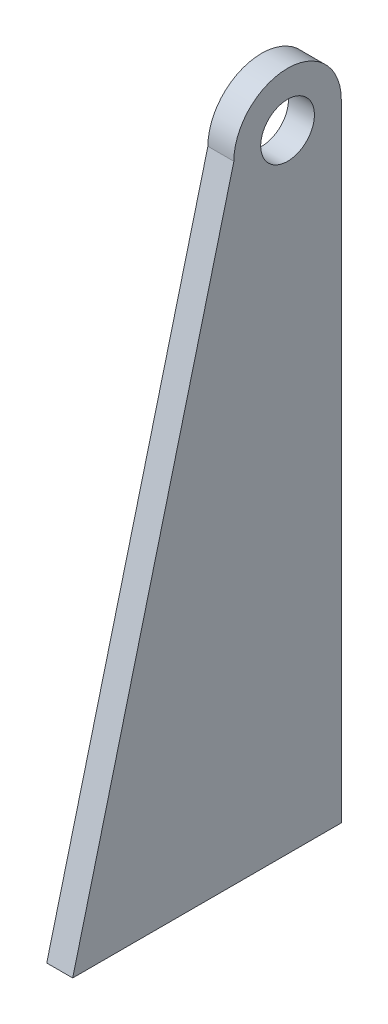
ISO-10303-21;
HEADER;
FILE_DESCRIPTION(('STEP AP214'),'2;1');
FILE_NAME('part.step','',(''),(''),'','','');
FILE_SCHEMA(('AUTOMOTIVE_DESIGN { 1 0 10303 214 1 1 1 1 }'));
ENDSEC;
DATA;
#1=APPLICATION_CONTEXT('core data for automotive mechanical design processes');
#2=APPLICATION_PROTOCOL_DEFINITION('international standard','automotive_design',2000,#1);
#3=PRODUCT_CONTEXT('',#1,'mechanical');
#4=PRODUCT('Part','Part','',(#3));
#5=PRODUCT_RELATED_PRODUCT_CATEGORY('part','',(#4));
#6=PRODUCT_DEFINITION_FORMATION('','',#4);
#7=PRODUCT_DEFINITION_CONTEXT('part definition',#1,'design');
#8=PRODUCT_DEFINITION('design','',#6,#7);
#9=PRODUCT_DEFINITION_SHAPE('','',#8);
#10=(LENGTH_UNIT() NAMED_UNIT(*) SI_UNIT(.MILLI.,.METRE.));
#11=(NAMED_UNIT(*) PLANE_ANGLE_UNIT() SI_UNIT($,.RADIAN.));
#12=(NAMED_UNIT(*) SI_UNIT($,.STERADIAN.) SOLID_ANGLE_UNIT());
#13=UNCERTAINTY_MEASURE_WITH_UNIT(LENGTH_MEASURE(1.E-05),#10,'distance_accuracy_value','');
#14=(GEOMETRIC_REPRESENTATION_CONTEXT(3) GLOBAL_UNCERTAINTY_ASSIGNED_CONTEXT((#13)) GLOBAL_UNIT_ASSIGNED_CONTEXT((#10,
#11,#12)) REPRESENTATION_CONTEXT('',''));
#15=CARTESIAN_POINT('',(0.,0.,0.));
#16=DIRECTION('',(0.,0.,1.));
#17=DIRECTION('',(1.,0.,0.));
#18=AXIS2_PLACEMENT_3D('',#15,#16,#17);
#19=CARTESIAN_POINT('',(5.8,140.,-48.));
#20=DIRECTION('',(1.,0.,0.));
#21=DIRECTION('',(0.,0.,-1.));
#22=AXIS2_PLACEMENT_3D('',#19,#20,#21);
#23=PLANE('',#22);
#24=DIRECTION('',(0.,-0.96849293259685,0.249041039810618));
#25=VECTOR('',#24,1.);
#26=CARTESIAN_POINT('',(5.8,0.,0.));
#27=LINE('',#26,#25);
#28=CARTESIAN_POINT('',(5.8,140.,-36.));
#29=VERTEX_POINT('',#28);
#30=CARTESIAN_POINT('',(5.8,0.,0.));
#31=VERTEX_POINT('',#30);
#32=EDGE_CURVE('E93',#29,#31,#27,.T.);
#33=ORIENTED_EDGE('',*,*,#32,.T.);
#34=DIRECTION('',(0.,0.,-1.));
#35=VECTOR('',#34,1.);
#36=CARTESIAN_POINT('',(5.8,0.,0.));
#37=LINE('',#36,#35);
#38=CARTESIAN_POINT('',(5.8,0.,-60.));
#39=VERTEX_POINT('',#38);
#40=EDGE_CURVE('E88',#31,#39,#37,.T.);
#41=ORIENTED_EDGE('',*,*,#40,.T.);
#42=DIRECTION('',(0.,1.,0.));
#43=VECTOR('',#42,1.);
#44=CARTESIAN_POINT('',(5.8,0.,-60.));
#45=LINE('',#44,#43);
#46=CARTESIAN_POINT('',(5.8,140.,-60.));
#47=VERTEX_POINT('',#46);
#48=EDGE_CURVE('E91',#39,#47,#45,.T.);
#49=ORIENTED_EDGE('',*,*,#48,.T.);
#50=CARTESIAN_POINT('',(5.8,140.,-48.));
#51=DIRECTION('',(1.,0.,0.));
#52=DIRECTION('',(0.,0.,-1.));
#53=AXIS2_PLACEMENT_3D('',#50,#51,#52);
#54=CIRCLE('',#53,12.);
#55=EDGE_CURVE('E58',#47,#29,#54,.T.);
#56=ORIENTED_EDGE('',*,*,#55,.T.);
#57=EDGE_LOOP('',(#33,#41,#49,#56));
#58=FACE_BOUND('',#57,.T.);
#59=CARTESIAN_POINT('',(5.8,140.,-48.));
#60=DIRECTION('',(1.,0.,0.));
#61=DIRECTION('',(0.,0.,-1.));
#62=AXIS2_PLACEMENT_3D('',#59,#60,#61);
#63=CIRCLE('',#62,6.);
#64=CARTESIAN_POINT('',(5.8,140.,-54.));
#65=VERTEX_POINT('',#64);
#66=EDGE_CURVE('E108',#65,#65,#63,.T.);
#67=ORIENTED_EDGE('',*,*,#66,.F.);
#68=EDGE_LOOP('',(#67));
#69=FACE_BOUND('',#68,.T.);
#70=ADVANCED_FACE('F41',(#58,#69),#23,.T.);
#71=CARTESIAN_POINT('',(0.,140.,-48.));
#72=DIRECTION('',(1.,0.,0.));
#73=DIRECTION('',(0.,0.,-1.));
#74=AXIS2_PLACEMENT_3D('',#71,#72,#73);
#75=PLANE('',#74);
#76=DIRECTION('',(0.,-0.96849293259685,0.249041039810618));
#77=VECTOR('',#76,1.);
#78=CARTESIAN_POINT('',(0.,0.,0.));
#79=LINE('',#78,#77);
#80=CARTESIAN_POINT('',(0.,140.,-36.));
#81=VERTEX_POINT('',#80);
#82=CARTESIAN_POINT('',(0.,0.,0.));
#83=VERTEX_POINT('',#82);
#84=EDGE_CURVE('E105',#81,#83,#79,.T.);
#85=ORIENTED_EDGE('',*,*,#84,.F.);
#86=CARTESIAN_POINT('',(0.,140.,-48.));
#87=DIRECTION('',(1.,0.,0.));
#88=DIRECTION('',(0.,0.,-1.));
#89=AXIS2_PLACEMENT_3D('',#86,#87,#88);
#90=CIRCLE('',#89,12.);
#91=CARTESIAN_POINT('',(0.,140.,-60.));
#92=VERTEX_POINT('',#91);
#93=EDGE_CURVE('E81',#92,#81,#90,.T.);
#94=ORIENTED_EDGE('',*,*,#93,.F.);
#95=DIRECTION('',(0.,1.,0.));
#96=VECTOR('',#95,1.);
#97=CARTESIAN_POINT('',(0.,0.,-60.));
#98=LINE('',#97,#96);
#99=CARTESIAN_POINT('',(0.,0.,-60.));
#100=VERTEX_POINT('',#99);
#101=EDGE_CURVE('E75',#100,#92,#98,.T.);
#102=ORIENTED_EDGE('',*,*,#101,.F.);
#103=DIRECTION('',(0.,0.,-1.));
#104=VECTOR('',#103,1.);
#105=CARTESIAN_POINT('',(0.,0.,0.));
#106=LINE('',#105,#104);
#107=EDGE_CURVE('E97',#83,#100,#106,.T.);
#108=ORIENTED_EDGE('',*,*,#107,.F.);
#109=EDGE_LOOP('',(#85,#94,#102,#108));
#110=FACE_BOUND('',#109,.T.);
#111=CARTESIAN_POINT('',(0.,140.,-48.));
#112=DIRECTION('',(1.,0.,0.));
#113=DIRECTION('',(0.,0.,-1.));
#114=AXIS2_PLACEMENT_3D('',#111,#112,#113);
#115=CIRCLE('',#114,6.);
#116=CARTESIAN_POINT('',(0.,140.,-54.));
#117=VERTEX_POINT('',#116);
#118=EDGE_CURVE('E120',#117,#117,#115,.T.);
#119=ORIENTED_EDGE('',*,*,#118,.T.);
#120=EDGE_LOOP('',(#119));
#121=FACE_BOUND('',#120,.T.);
#122=ADVANCED_FACE('F116',(#110,#121),#75,.F.);
#123=CARTESIAN_POINT('',(5.8,0.,0.));
#124=DIRECTION('',(0.,-0.249041039810619,-0.96849293259685));
#125=DIRECTION('',(0.,0.96849293259685,-0.249041039810619));
#126=AXIS2_PLACEMENT_3D('',#123,#124,#125);
#127=PLANE('',#126);
#128=ORIENTED_EDGE('',*,*,#84,.T.);
#129=DIRECTION('',(-1.,0.,0.));
#130=VECTOR('',#129,1.);
#131=CARTESIAN_POINT('',(5.8,0.,0.));
#132=LINE('',#131,#130);
#133=EDGE_CURVE('E11',#31,#83,#132,.T.);
#134=ORIENTED_EDGE('',*,*,#133,.F.);
#135=ORIENTED_EDGE('',*,*,#32,.F.);
#136=DIRECTION('',(-1.,0.,0.));
#137=VECTOR('',#136,1.);
#138=CARTESIAN_POINT('',(5.8,140.,-36.));
#139=LINE('',#138,#137);
#140=EDGE_CURVE('E101',#29,#81,#139,.T.);
#141=ORIENTED_EDGE('',*,*,#140,.T.);
#142=EDGE_LOOP('',(#128,#134,#135,#141));
#143=FACE_BOUND('',#142,.T.);
#144=ADVANCED_FACE('F43',(#143),#127,.F.);
#145=CARTESIAN_POINT('',(5.8,0.,0.));
#146=DIRECTION('',(0.,1.,0.));
#147=DIRECTION('',(0.,0.,1.));
#148=AXIS2_PLACEMENT_3D('',#145,#146,#147);
#149=PLANE('',#148);
#150=ORIENTED_EDGE('',*,*,#107,.T.);
#151=DIRECTION('',(-1.,0.,0.));
#152=VECTOR('',#151,1.);
#153=CARTESIAN_POINT('',(5.8,0.,-60.));
#154=LINE('',#153,#152);
#155=EDGE_CURVE('E50',#39,#100,#154,.T.);
#156=ORIENTED_EDGE('',*,*,#155,.F.);
#157=ORIENTED_EDGE('',*,*,#40,.F.);
#158=ORIENTED_EDGE('',*,*,#133,.T.);
#159=EDGE_LOOP('',(#150,#156,#157,#158));
#160=FACE_BOUND('',#159,.T.);
#161=ADVANCED_FACE('F96',(#160),#149,.F.);
#162=CARTESIAN_POINT('',(5.8,0.,-60.));
#163=DIRECTION('',(0.,0.,1.));
#164=DIRECTION('',(1.,0.,0.));
#165=AXIS2_PLACEMENT_3D('',#162,#163,#164);
#166=PLANE('',#165);
#167=ORIENTED_EDGE('',*,*,#101,.T.);
#168=DIRECTION('',(-1.,0.,0.));
#169=VECTOR('',#168,1.);
#170=CARTESIAN_POINT('',(5.8,140.,-60.));
#171=LINE('',#170,#169);
#172=EDGE_CURVE('E98',#47,#92,#171,.T.);
#173=ORIENTED_EDGE('',*,*,#172,.F.);
#174=ORIENTED_EDGE('',*,*,#48,.F.);
#175=ORIENTED_EDGE('',*,*,#155,.T.);
#176=EDGE_LOOP('',(#167,#173,#174,#175));
#177=FACE_BOUND('',#176,.T.);
#178=ADVANCED_FACE('F99',(#177),#166,.F.);
#179=CARTESIAN_POINT('',(5.8,140.,-48.));
#180=DIRECTION('',(-1.,0.,0.));
#181=DIRECTION('',(0.,0.,1.));
#182=AXIS2_PLACEMENT_3D('',#179,#180,#181);
#183=CYLINDRICAL_SURFACE('',#182,12.);
#184=ORIENTED_EDGE('',*,*,#93,.T.);
#185=ORIENTED_EDGE('',*,*,#140,.F.);
#186=ORIENTED_EDGE('',*,*,#55,.F.);
#187=ORIENTED_EDGE('',*,*,#172,.T.);
#188=EDGE_LOOP('',(#184,#185,#186,#187));
#189=FACE_BOUND('',#188,.T.);
#190=ADVANCED_FACE('F113',(#189),#183,.T.);
#191=CARTESIAN_POINT('',(5.8,140.,-48.));
#192=DIRECTION('',(-1.,0.,0.));
#193=DIRECTION('',(0.,0.,1.));
#194=AXIS2_PLACEMENT_3D('',#191,#192,#193);
#195=CYLINDRICAL_SURFACE('',#194,6.);
#196=ORIENTED_EDGE('',*,*,#66,.T.);
#197=EDGE_LOOP('',(#196));
#198=FACE_BOUND('',#197,.T.);
#199=ORIENTED_EDGE('',*,*,#118,.F.);
#200=EDGE_LOOP('',(#199));
#201=FACE_BOUND('',#200,.T.);
#202=ADVANCED_FACE('F126',(#198,#201),#195,.F.);
#203=CLOSED_SHELL('',(#70,#122,#144,#161,#178,#190,#202));
#204=MANIFOLD_SOLID_BREP('B2',#203);
#205=ADVANCED_BREP_SHAPE_REPRESENTATION('',(#18,#204),#14);
#206=SHAPE_DEFINITION_REPRESENTATION(#9,#205);
ENDSEC;
END-ISO-10303-21;
